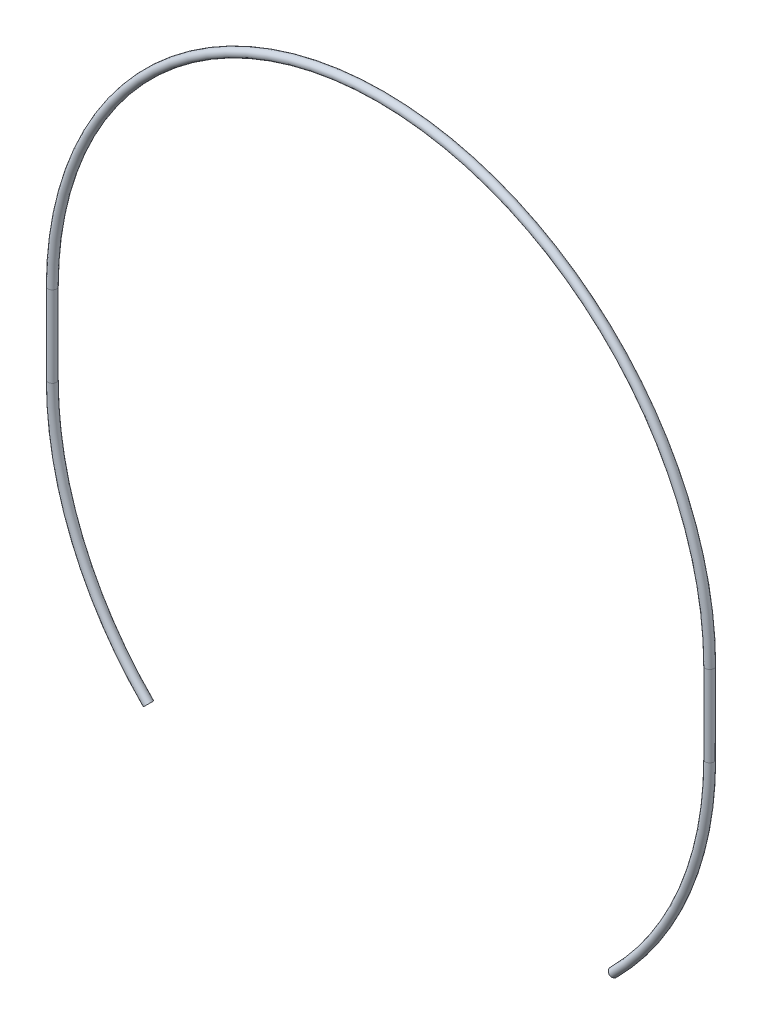
ISO-10303-21;
HEADER;
FILE_DESCRIPTION(('STEP AP214'),'2;1');
FILE_NAME('part.step','',(''),(''),'','','');
FILE_SCHEMA(('AUTOMOTIVE_DESIGN { 1 0 10303 214 1 1 1 1 }'));
ENDSEC;
DATA;
#1=APPLICATION_CONTEXT('core data for automotive mechanical design processes');
#2=APPLICATION_PROTOCOL_DEFINITION('international standard','automotive_design',2000,#1);
#3=PRODUCT_CONTEXT('',#1,'mechanical');
#4=PRODUCT('Part','Part','',(#3));
#5=PRODUCT_RELATED_PRODUCT_CATEGORY('part','',(#4));
#6=PRODUCT_DEFINITION_FORMATION('','',#4);
#7=PRODUCT_DEFINITION_CONTEXT('part definition',#1,'design');
#8=PRODUCT_DEFINITION('design','',#6,#7);
#9=PRODUCT_DEFINITION_SHAPE('','',#8);
#10=(LENGTH_UNIT() NAMED_UNIT(*) SI_UNIT(.MILLI.,.METRE.));
#11=(NAMED_UNIT(*) PLANE_ANGLE_UNIT() SI_UNIT($,.RADIAN.));
#12=(NAMED_UNIT(*) SI_UNIT($,.STERADIAN.) SOLID_ANGLE_UNIT());
#13=UNCERTAINTY_MEASURE_WITH_UNIT(LENGTH_MEASURE(1.E-05),#10,'distance_accuracy_value','');
#14=(GEOMETRIC_REPRESENTATION_CONTEXT(3) GLOBAL_UNCERTAINTY_ASSIGNED_CONTEXT((#13)) GLOBAL_UNIT_ASSIGNED_CONTEXT((#10,
#11,#12)) REPRESENTATION_CONTEXT('',''));
#15=CARTESIAN_POINT('',(0.,0.,0.));
#16=DIRECTION('',(0.,0.,1.));
#17=DIRECTION('',(1.,0.,0.));
#18=AXIS2_PLACEMENT_3D('',#15,#16,#17);
#19=CARTESIAN_POINT('',(137.885822331376,-185.885822331377,0.));
#20=DIRECTION('',(-0.707106781186549,-0.707106781186546,0.));
#21=DIRECTION('',(0.707106781186546,-0.707106781186549,0.));
#22=AXIS2_PLACEMENT_3D('',#19,#20,#21);
#23=PLANE('',#22);
#24=CARTESIAN_POINT('',(137.885822331376,-185.885822331377,0.));
#25=DIRECTION('',(-0.707106781186549,-0.707106781186546,0.));
#26=DIRECTION('',(0.707106781186546,-0.707106781186549,0.));
#27=AXIS2_PLACEMENT_3D('',#24,#25,#26);
#28=CIRCLE('',#27,2.49999999999999);
#29=CARTESIAN_POINT('',(139.653589284343,-187.653589284343,0.));
#30=VERTEX_POINT('',#29);
#31=EDGE_CURVE('E69',#30,#30,#28,.T.);
#32=ORIENTED_EDGE('',*,*,#31,.T.);
#33=EDGE_LOOP('',(#32));
#34=FACE_BOUND('',#33,.T.);
#35=ADVANCED_FACE('F47',(#34),#23,.T.);
#36=CARTESIAN_POINT('',(-137.885822331378,-185.885822331376,0.));
#37=DIRECTION('',(-0.707106781186544,0.707106781186551,0.));
#38=DIRECTION('',(-0.707106781186551,-0.707106781186544,0.));
#39=AXIS2_PLACEMENT_3D('',#36,#37,#38);
#40=PLANE('',#39);
#41=CARTESIAN_POINT('',(-137.885822331378,-185.885822331376,0.));
#42=DIRECTION('',(-0.707106781186544,0.707106781186551,0.));
#43=DIRECTION('',(-0.707106781186551,-0.707106781186544,0.));
#44=AXIS2_PLACEMENT_3D('',#41,#42,#43);
#45=CIRCLE('',#44,2.49999999999999);
#46=CARTESIAN_POINT('',(-139.653589284344,-187.653589284342,0.));
#47=VERTEX_POINT('',#46);
#48=EDGE_CURVE('E11',#47,#47,#45,.T.);
#49=ORIENTED_EDGE('',*,*,#48,.F.);
#50=EDGE_LOOP('',(#49));
#51=FACE_BOUND('',#50,.T.);
#52=ADVANCED_FACE('F77',(#51),#40,.F.);
#53=CARTESIAN_POINT('',(0.,-48.,0.));
#54=DIRECTION('',(0.,0.,1.));
#55=DIRECTION('',(1.,0.,0.));
#56=AXIS2_PLACEMENT_3D('',#53,#54,#55);
#57=TOROIDAL_SURFACE('',#56,195.,2.49999999999999);
#58=CARTESIAN_POINT('',(195.,-48.,0.));
#59=DIRECTION('',(0.,-1.,0.));
#60=DIRECTION('',(1.,0.,0.));
#61=AXIS2_PLACEMENT_3D('',#58,#59,#60);
#62=CIRCLE('',#61,2.49999999999999);
#63=CARTESIAN_POINT('',(197.5,-48.,0.));
#64=VERTEX_POINT('',#63);
#65=EDGE_CURVE('E66',#64,#64,#62,.T.);
#66=CARTESIAN_POINT('',(0.,-48.,0.));
#67=DIRECTION('',(0.,0.,1.));
#68=DIRECTION('',(1.,0.,0.));
#69=AXIS2_PLACEMENT_3D('',#66,#67,#68);
#70=CIRCLE('',#69,197.5);
#71=EDGE_CURVE('',#30,#64,#70,.T.);
#72=ORIENTED_EDGE('',*,*,#31,.F.);
#73=ORIENTED_EDGE('',*,*,#65,.T.);
#74=ORIENTED_EDGE('',*,*,#71,.T.);
#75=ORIENTED_EDGE('',*,*,#71,.F.);
#76=EDGE_LOOP('',(#72,#74,#73,#75));
#77=FACE_BOUND('',#76,.T.);
#78=ADVANCED_FACE('F74',(#77),#57,.T.);
#79=CARTESIAN_POINT('',(195.,-48.,0.));
#80=DIRECTION('',(0.,1.,0.));
#81=DIRECTION('',(0.,0.,1.));
#82=AXIS2_PLACEMENT_3D('',#79,#80,#81);
#83=CYLINDRICAL_SURFACE('',#82,2.49999999999999);
#84=CARTESIAN_POINT('',(195.,0.,0.));
#85=DIRECTION('',(0.,-1.,0.));
#86=DIRECTION('',(1.,0.,0.));
#87=AXIS2_PLACEMENT_3D('',#84,#85,#86);
#88=CIRCLE('',#87,2.49999999999999);
#89=CARTESIAN_POINT('',(197.5,0.,0.));
#90=VERTEX_POINT('',#89);
#91=EDGE_CURVE('E61',#90,#90,#88,.T.);
#92=ORIENTED_EDGE('',*,*,#91,.T.);
#93=EDGE_LOOP('',(#92));
#94=FACE_BOUND('',#93,.T.);
#95=ORIENTED_EDGE('',*,*,#65,.F.);
#96=EDGE_LOOP('',(#95));
#97=FACE_BOUND('',#96,.T.);
#98=ADVANCED_FACE('F76',(#94,#97),#83,.T.);
#99=CARTESIAN_POINT('',(0.,0.,0.));
#100=DIRECTION('',(0.,0.,1.));
#101=DIRECTION('',(1.,0.,0.));
#102=AXIS2_PLACEMENT_3D('',#99,#100,#101);
#103=TOROIDAL_SURFACE('',#102,195.,2.49999999999999);
#104=CARTESIAN_POINT('',(-195.,0.,0.));
#105=DIRECTION('',(0.,1.,0.));
#106=DIRECTION('',(-1.,0.,0.));
#107=AXIS2_PLACEMENT_3D('',#104,#105,#106);
#108=CIRCLE('',#107,2.49999999999999);
#109=CARTESIAN_POINT('',(-197.5,0.,0.));
#110=VERTEX_POINT('',#109);
#111=EDGE_CURVE('E57',#110,#110,#108,.T.);
#112=CARTESIAN_POINT('',(0.,0.,0.));
#113=DIRECTION('',(0.,0.,1.));
#114=DIRECTION('',(1.,0.,0.));
#115=AXIS2_PLACEMENT_3D('',#112,#113,#114);
#116=CIRCLE('',#115,197.5);
#117=EDGE_CURVE('',#90,#110,#116,.T.);
#118=ORIENTED_EDGE('',*,*,#91,.F.);
#119=ORIENTED_EDGE('',*,*,#111,.T.);
#120=ORIENTED_EDGE('',*,*,#117,.T.);
#121=ORIENTED_EDGE('',*,*,#117,.F.);
#122=EDGE_LOOP('',(#118,#120,#119,#121));
#123=FACE_BOUND('',#122,.T.);
#124=ADVANCED_FACE('F84',(#123),#103,.T.);
#125=CARTESIAN_POINT('',(-195.,0.,0.));
#126=DIRECTION('',(0.,-1.,0.));
#127=DIRECTION('',(0.,0.,-1.));
#128=AXIS2_PLACEMENT_3D('',#125,#126,#127);
#129=CYLINDRICAL_SURFACE('',#128,2.49999999999999);
#130=CARTESIAN_POINT('',(-195.,-48.,0.));
#131=DIRECTION('',(0.,1.,0.));
#132=DIRECTION('',(-1.,0.,0.));
#133=AXIS2_PLACEMENT_3D('',#130,#131,#132);
#134=CIRCLE('',#133,2.49999999999999);
#135=CARTESIAN_POINT('',(-197.5,-48.,0.));
#136=VERTEX_POINT('',#135);
#137=EDGE_CURVE('E53',#136,#136,#134,.T.);
#138=ORIENTED_EDGE('',*,*,#137,.T.);
#139=EDGE_LOOP('',(#138));
#140=FACE_BOUND('',#139,.T.);
#141=ORIENTED_EDGE('',*,*,#111,.F.);
#142=EDGE_LOOP('',(#141));
#143=FACE_BOUND('',#142,.T.);
#144=ADVANCED_FACE('F90',(#140,#143),#129,.T.);
#145=CARTESIAN_POINT('',(0.,-48.,0.));
#146=DIRECTION('',(0.,0.,1.));
#147=DIRECTION('',(1.,0.,0.));
#148=AXIS2_PLACEMENT_3D('',#145,#146,#147);
#149=TOROIDAL_SURFACE('',#148,195.,2.49999999999999);
#150=CARTESIAN_POINT('',(0.,-48.,0.));
#151=DIRECTION('',(0.,0.,1.));
#152=DIRECTION('',(1.,0.,0.));
#153=AXIS2_PLACEMENT_3D('',#150,#151,#152);
#154=CIRCLE('',#153,197.5);
#155=EDGE_CURVE('',#136,#47,#154,.T.);
#156=ORIENTED_EDGE('',*,*,#137,.F.);
#157=ORIENTED_EDGE('',*,*,#48,.T.);
#158=ORIENTED_EDGE('',*,*,#155,.T.);
#159=ORIENTED_EDGE('',*,*,#155,.F.);
#160=EDGE_LOOP('',(#156,#158,#157,#159));
#161=FACE_BOUND('',#160,.T.);
#162=ADVANCED_FACE('F88',(#161),#149,.T.);
#163=CLOSED_SHELL('',(#35,#52,#78,#98,#124,#144,#162));
#164=MANIFOLD_SOLID_BREP('B2',#163);
#165=ADVANCED_BREP_SHAPE_REPRESENTATION('',(#18,#164),#14);
#166=SHAPE_DEFINITION_REPRESENTATION(#9,#165);
ENDSEC;
END-ISO-10303-21;
